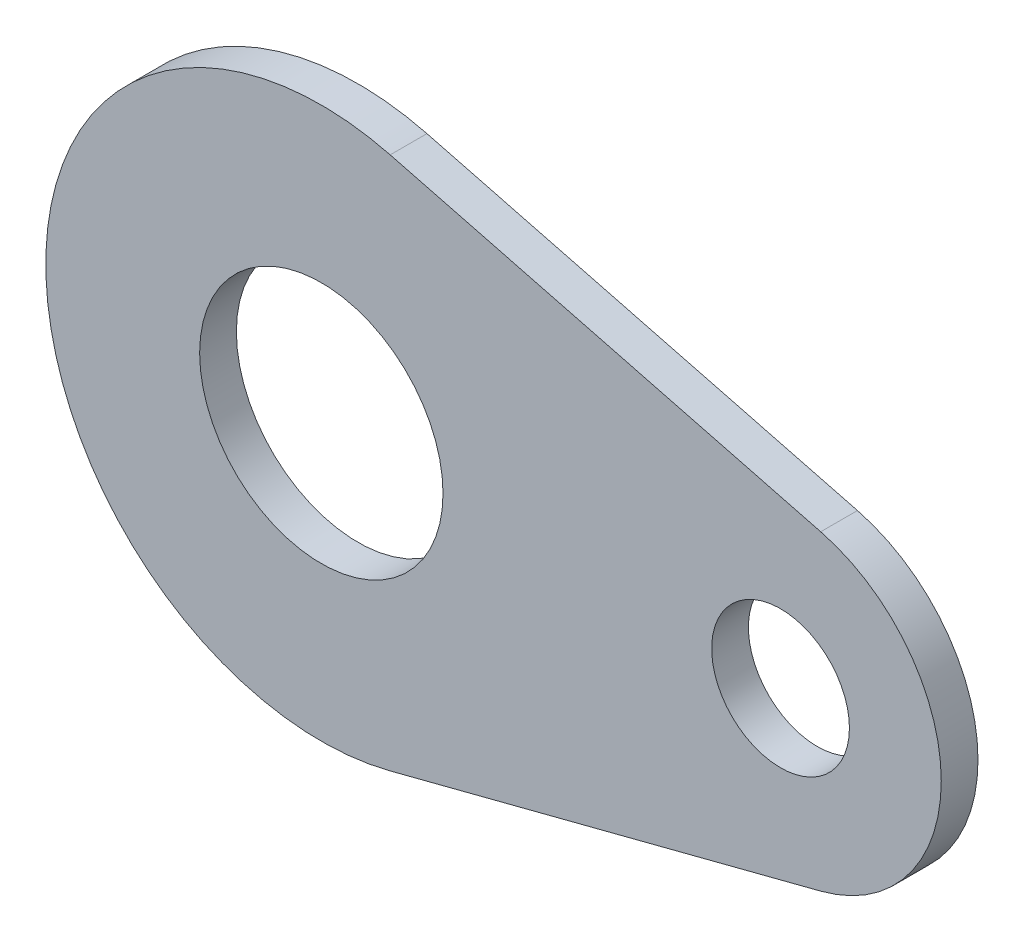
ISO-10303-21;
HEADER;
FILE_DESCRIPTION(('STEP AP214'),'2;1');
FILE_NAME('part.step','',(''),(''),'','','');
FILE_SCHEMA(('AUTOMOTIVE_DESIGN { 1 0 10303 214 1 1 1 1 }'));
ENDSEC;
DATA;
#1=APPLICATION_CONTEXT('core data for automotive mechanical design processes');
#2=APPLICATION_PROTOCOL_DEFINITION('international standard','automotive_design',2000,#1);
#3=PRODUCT_CONTEXT('',#1,'mechanical');
#4=PRODUCT('Part','Part','',(#3));
#5=PRODUCT_RELATED_PRODUCT_CATEGORY('part','',(#4));
#6=PRODUCT_DEFINITION_FORMATION('','',#4);
#7=PRODUCT_DEFINITION_CONTEXT('part definition',#1,'design');
#8=PRODUCT_DEFINITION('design','',#6,#7);
#9=PRODUCT_DEFINITION_SHAPE('','',#8);
#10=(LENGTH_UNIT() NAMED_UNIT(*) SI_UNIT(.MILLI.,.METRE.));
#11=(NAMED_UNIT(*) PLANE_ANGLE_UNIT() SI_UNIT($,.RADIAN.));
#12=(NAMED_UNIT(*) SI_UNIT($,.STERADIAN.) SOLID_ANGLE_UNIT());
#13=UNCERTAINTY_MEASURE_WITH_UNIT(LENGTH_MEASURE(1.E-05),#10,'distance_accuracy_value','');
#14=(GEOMETRIC_REPRESENTATION_CONTEXT(3) GLOBAL_UNCERTAINTY_ASSIGNED_CONTEXT((#13)) GLOBAL_UNIT_ASSIGNED_CONTEXT((#10,
#11,#12)) REPRESENTATION_CONTEXT('',''));
#15=CARTESIAN_POINT('',(0.,0.,0.));
#16=DIRECTION('',(0.,0.,1.));
#17=DIRECTION('',(1.,0.,0.));
#18=AXIS2_PLACEMENT_3D('',#15,#16,#17);
#19=CARTESIAN_POINT('',(0.,0.,0.8));
#20=DIRECTION('',(0.,0.,1.));
#21=DIRECTION('',(1.,0.,0.));
#22=AXIS2_PLACEMENT_3D('',#19,#20,#21);
#23=PLANE('',#22);
#24=CARTESIAN_POINT('',(0.,0.,0.8));
#25=DIRECTION('',(0.,0.,1.));
#26=DIRECTION('',(1.,0.,0.));
#27=AXIS2_PLACEMENT_3D('',#24,#25,#26);
#28=CIRCLE('',#27,2.65);
#29=CARTESIAN_POINT('',(2.65,0.,0.8));
#30=VERTEX_POINT('',#29);
#31=EDGE_CURVE('E104',#30,#30,#28,.T.);
#32=ORIENTED_EDGE('',*,*,#31,.F.);
#33=EDGE_LOOP('',(#32));
#34=FACE_BOUND('',#33,.T.);
#35=CARTESIAN_POINT('',(0.,0.,0.8));
#36=DIRECTION('',(0.,0.,1.));
#37=DIRECTION('',(1.,0.,0.));
#38=AXIS2_PLACEMENT_3D('',#35,#36,#37);
#39=CIRCLE('',#38,6.);
#40=CARTESIAN_POINT('',(1.5,5.80947501931113,0.8));
#41=VERTEX_POINT('',#40);
#42=CARTESIAN_POINT('',(1.5,-5.80947501931113,0.8));
#43=VERTEX_POINT('',#42);
#44=EDGE_CURVE('E89',#41,#43,#39,.T.);
#45=ORIENTED_EDGE('',*,*,#44,.T.);
#46=DIRECTION('',(0.968245836551854,0.25,0.));
#47=VECTOR('',#46,1.);
#48=CARTESIAN_POINT('',(10.875,-3.38886042793149,0.8));
#49=LINE('',#48,#47);
#50=CARTESIAN_POINT('',(10.875,-3.38886042793149,0.8));
#51=VERTEX_POINT('',#50);
#52=EDGE_CURVE('E84',#43,#51,#49,.T.);
#53=ORIENTED_EDGE('',*,*,#52,.T.);
#54=CARTESIAN_POINT('',(10.,0.,0.8));
#55=DIRECTION('',(0.,0.,1.));
#56=DIRECTION('',(-1.,0.,0.));
#57=AXIS2_PLACEMENT_3D('',#54,#55,#56);
#58=CIRCLE('',#57,3.5);
#59=CARTESIAN_POINT('',(10.875,3.38886042793149,0.8));
#60=VERTEX_POINT('',#59);
#61=EDGE_CURVE('E87',#51,#60,#58,.T.);
#62=ORIENTED_EDGE('',*,*,#61,.T.);
#63=DIRECTION('',(-0.968245836551854,0.25,0.));
#64=VECTOR('',#63,1.);
#65=CARTESIAN_POINT('',(1.5,5.80947501931113,0.8));
#66=LINE('',#65,#64);
#67=EDGE_CURVE('E54',#60,#41,#66,.T.);
#68=ORIENTED_EDGE('',*,*,#67,.T.);
#69=EDGE_LOOP('',(#45,#53,#62,#68));
#70=FACE_BOUND('',#69,.T.);
#71=CARTESIAN_POINT('',(10.,0.,0.8));
#72=DIRECTION('',(0.,0.,1.));
#73=DIRECTION('',(1.,0.,0.));
#74=AXIS2_PLACEMENT_3D('',#71,#72,#73);
#75=CIRCLE('',#74,1.5);
#76=CARTESIAN_POINT('',(11.5,0.,0.8));
#77=VERTEX_POINT('',#76);
#78=EDGE_CURVE('E119',#77,#77,#75,.T.);
#79=ORIENTED_EDGE('',*,*,#78,.F.);
#80=EDGE_LOOP('',(#79));
#81=FACE_BOUND('',#80,.T.);
#82=ADVANCED_FACE('F37',(#34,#70,#81),#23,.T.);
#83=CARTESIAN_POINT('',(0.,0.,0.));
#84=DIRECTION('',(0.,0.,1.));
#85=DIRECTION('',(1.,0.,0.));
#86=AXIS2_PLACEMENT_3D('',#83,#84,#85);
#87=PLANE('',#86);
#88=CARTESIAN_POINT('',(0.,0.,0.));
#89=DIRECTION('',(0.,0.,1.));
#90=DIRECTION('',(1.,0.,0.));
#91=AXIS2_PLACEMENT_3D('',#88,#89,#90);
#92=CIRCLE('',#91,6.);
#93=CARTESIAN_POINT('',(1.5,5.80947501931113,0.));
#94=VERTEX_POINT('',#93);
#95=CARTESIAN_POINT('',(1.5,-5.80947501931113,0.));
#96=VERTEX_POINT('',#95);
#97=EDGE_CURVE('E101',#94,#96,#92,.T.);
#98=ORIENTED_EDGE('',*,*,#97,.F.);
#99=DIRECTION('',(-0.968245836551854,0.25,0.));
#100=VECTOR('',#99,1.);
#101=CARTESIAN_POINT('',(1.5,5.80947501931113,0.));
#102=LINE('',#101,#100);
#103=CARTESIAN_POINT('',(10.875,3.38886042793149,0.));
#104=VERTEX_POINT('',#103);
#105=EDGE_CURVE('E77',#104,#94,#102,.T.);
#106=ORIENTED_EDGE('',*,*,#105,.F.);
#107=CARTESIAN_POINT('',(10.,0.,0.));
#108=DIRECTION('',(0.,0.,1.));
#109=DIRECTION('',(-1.,0.,0.));
#110=AXIS2_PLACEMENT_3D('',#107,#108,#109);
#111=CIRCLE('',#110,3.5);
#112=CARTESIAN_POINT('',(10.875,-3.38886042793149,0.));
#113=VERTEX_POINT('',#112);
#114=EDGE_CURVE('E71',#113,#104,#111,.T.);
#115=ORIENTED_EDGE('',*,*,#114,.F.);
#116=DIRECTION('',(0.968245836551854,0.25,0.));
#117=VECTOR('',#116,1.);
#118=CARTESIAN_POINT('',(10.875,-3.38886042793149,0.));
#119=LINE('',#118,#117);
#120=EDGE_CURVE('E93',#96,#113,#119,.T.);
#121=ORIENTED_EDGE('',*,*,#120,.F.);
#122=EDGE_LOOP('',(#98,#106,#115,#121));
#123=FACE_BOUND('',#122,.T.);
#124=CARTESIAN_POINT('',(0.,0.,0.));
#125=DIRECTION('',(0.,0.,1.));
#126=DIRECTION('',(1.,0.,0.));
#127=AXIS2_PLACEMENT_3D('',#124,#125,#126);
#128=CIRCLE('',#127,2.65);
#129=CARTESIAN_POINT('',(2.65,0.,0.));
#130=VERTEX_POINT('',#129);
#131=EDGE_CURVE('E116',#130,#130,#128,.T.);
#132=ORIENTED_EDGE('',*,*,#131,.T.);
#133=EDGE_LOOP('',(#132));
#134=FACE_BOUND('',#133,.T.);
#135=CARTESIAN_POINT('',(10.,0.,0.));
#136=DIRECTION('',(0.,0.,1.));
#137=DIRECTION('',(1.,0.,0.));
#138=AXIS2_PLACEMENT_3D('',#135,#136,#137);
#139=CIRCLE('',#138,1.5);
#140=CARTESIAN_POINT('',(11.5,0.,0.));
#141=VERTEX_POINT('',#140);
#142=EDGE_CURVE('E122',#141,#141,#139,.T.);
#143=ORIENTED_EDGE('',*,*,#142,.T.);
#144=EDGE_LOOP('',(#143));
#145=FACE_BOUND('',#144,.T.);
#146=ADVANCED_FACE('F112',(#123,#134,#145),#87,.F.);
#147=CARTESIAN_POINT('',(0.,0.,0.8));
#148=DIRECTION('',(0.,0.,-1.));
#149=DIRECTION('',(-1.,0.,0.));
#150=AXIS2_PLACEMENT_3D('',#147,#148,#149);
#151=CYLINDRICAL_SURFACE('',#150,6.);
#152=ORIENTED_EDGE('',*,*,#97,.T.);
#153=DIRECTION('',(0.,0.,-1.));
#154=VECTOR('',#153,1.);
#155=CARTESIAN_POINT('',(1.5,-5.80947501931113,0.8));
#156=LINE('',#155,#154);
#157=EDGE_CURVE('E11',#43,#96,#156,.T.);
#158=ORIENTED_EDGE('',*,*,#157,.F.);
#159=ORIENTED_EDGE('',*,*,#44,.F.);
#160=DIRECTION('',(0.,0.,-1.));
#161=VECTOR('',#160,1.);
#162=CARTESIAN_POINT('',(1.5,5.80947501931113,0.8));
#163=LINE('',#162,#161);
#164=EDGE_CURVE('E97',#41,#94,#163,.T.);
#165=ORIENTED_EDGE('',*,*,#164,.T.);
#166=EDGE_LOOP('',(#152,#158,#159,#165));
#167=FACE_BOUND('',#166,.T.);
#168=ADVANCED_FACE('F39',(#167),#151,.T.);
#169=CARTESIAN_POINT('',(10.875,-3.38886042793149,0.8));
#170=DIRECTION('',(-0.25,0.968245836551854,0.));
#171=DIRECTION('',(-0.968245836551854,-0.25,0.));
#172=AXIS2_PLACEMENT_3D('',#169,#170,#171);
#173=PLANE('',#172);
#174=ORIENTED_EDGE('',*,*,#120,.T.);
#175=DIRECTION('',(0.,0.,-1.));
#176=VECTOR('',#175,1.);
#177=CARTESIAN_POINT('',(10.875,-3.38886042793149,0.8));
#178=LINE('',#177,#176);
#179=EDGE_CURVE('E46',#51,#113,#178,.T.);
#180=ORIENTED_EDGE('',*,*,#179,.F.);
#181=ORIENTED_EDGE('',*,*,#52,.F.);
#182=ORIENTED_EDGE('',*,*,#157,.T.);
#183=EDGE_LOOP('',(#174,#180,#181,#182));
#184=FACE_BOUND('',#183,.T.);
#185=ADVANCED_FACE('F92',(#184),#173,.F.);
#186=CARTESIAN_POINT('',(10.,0.,0.8));
#187=DIRECTION('',(0.,0.,-1.));
#188=DIRECTION('',(-1.,0.,0.));
#189=AXIS2_PLACEMENT_3D('',#186,#187,#188);
#190=CYLINDRICAL_SURFACE('',#189,3.5);
#191=ORIENTED_EDGE('',*,*,#114,.T.);
#192=DIRECTION('',(0.,0.,-1.));
#193=VECTOR('',#192,1.);
#194=CARTESIAN_POINT('',(10.875,3.38886042793149,0.8));
#195=LINE('',#194,#193);
#196=EDGE_CURVE('E94',#60,#104,#195,.T.);
#197=ORIENTED_EDGE('',*,*,#196,.F.);
#198=ORIENTED_EDGE('',*,*,#61,.F.);
#199=ORIENTED_EDGE('',*,*,#179,.T.);
#200=EDGE_LOOP('',(#191,#197,#198,#199));
#201=FACE_BOUND('',#200,.T.);
#202=ADVANCED_FACE('F95',(#201),#190,.T.);
#203=CARTESIAN_POINT('',(1.5,5.80947501931113,0.8));
#204=DIRECTION('',(-0.25,-0.968245836551854,0.));
#205=DIRECTION('',(0.968245836551854,-0.25,0.));
#206=AXIS2_PLACEMENT_3D('',#203,#204,#205);
#207=PLANE('',#206);
#208=ORIENTED_EDGE('',*,*,#105,.T.);
#209=ORIENTED_EDGE('',*,*,#164,.F.);
#210=ORIENTED_EDGE('',*,*,#67,.F.);
#211=ORIENTED_EDGE('',*,*,#196,.T.);
#212=EDGE_LOOP('',(#208,#209,#210,#211));
#213=FACE_BOUND('',#212,.T.);
#214=ADVANCED_FACE('F109',(#213),#207,.F.);
#215=CARTESIAN_POINT('',(0.,0.,0.8));
#216=DIRECTION('',(0.,0.,-1.));
#217=DIRECTION('',(-1.,0.,0.));
#218=AXIS2_PLACEMENT_3D('',#215,#216,#217);
#219=CYLINDRICAL_SURFACE('',#218,2.65);
#220=ORIENTED_EDGE('',*,*,#31,.T.);
#221=EDGE_LOOP('',(#220));
#222=FACE_BOUND('',#221,.T.);
#223=ORIENTED_EDGE('',*,*,#131,.F.);
#224=EDGE_LOOP('',(#223));
#225=FACE_BOUND('',#224,.T.);
#226=ADVANCED_FACE('F139',(#222,#225),#219,.F.);
#227=CARTESIAN_POINT('',(10.,0.,0.8));
#228=DIRECTION('',(0.,0.,-1.));
#229=DIRECTION('',(-1.,0.,0.));
#230=AXIS2_PLACEMENT_3D('',#227,#228,#229);
#231=CYLINDRICAL_SURFACE('',#230,1.5);
#232=ORIENTED_EDGE('',*,*,#78,.T.);
#233=EDGE_LOOP('',(#232));
#234=FACE_BOUND('',#233,.T.);
#235=ORIENTED_EDGE('',*,*,#142,.F.);
#236=EDGE_LOOP('',(#235));
#237=FACE_BOUND('',#236,.T.);
#238=ADVANCED_FACE('F128',(#234,#237),#231,.F.);
#239=CLOSED_SHELL('',(#82,#146,#168,#185,#202,#214,#226,#238));
#240=MANIFOLD_SOLID_BREP('B2',#239);
#241=ADVANCED_BREP_SHAPE_REPRESENTATION('',(#18,#240),#14);
#242=SHAPE_DEFINITION_REPRESENTATION(#9,#241);
ENDSEC;
END-ISO-10303-21;
